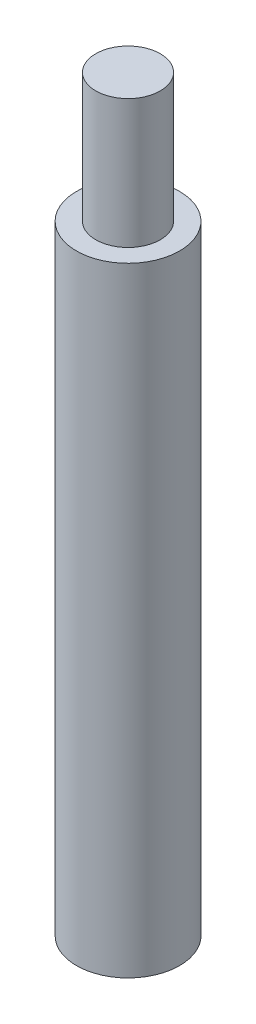
ISO-10303-21;
HEADER;
FILE_DESCRIPTION(('STEP AP214'),'2;1');
FILE_NAME('part.step','',(''),(''),'','','');
FILE_SCHEMA(('AUTOMOTIVE_DESIGN { 1 0 10303 214 1 1 1 1 }'));
ENDSEC;
DATA;
#1=APPLICATION_CONTEXT('core data for automotive mechanical design processes');
#2=APPLICATION_PROTOCOL_DEFINITION('international standard','automotive_design',2000,#1);
#3=PRODUCT_CONTEXT('',#1,'mechanical');
#4=PRODUCT('Part','Part','',(#3));
#5=PRODUCT_RELATED_PRODUCT_CATEGORY('part','',(#4));
#6=PRODUCT_DEFINITION_FORMATION('','',#4);
#7=PRODUCT_DEFINITION_CONTEXT('part definition',#1,'design');
#8=PRODUCT_DEFINITION('design','',#6,#7);
#9=PRODUCT_DEFINITION_SHAPE('','',#8);
#10=(LENGTH_UNIT() NAMED_UNIT(*) SI_UNIT(.MILLI.,.METRE.));
#11=(NAMED_UNIT(*) PLANE_ANGLE_UNIT() SI_UNIT($,.RADIAN.));
#12=(NAMED_UNIT(*) SI_UNIT($,.STERADIAN.) SOLID_ANGLE_UNIT());
#13=UNCERTAINTY_MEASURE_WITH_UNIT(LENGTH_MEASURE(1.E-05),#10,'distance_accuracy_value','');
#14=(GEOMETRIC_REPRESENTATION_CONTEXT(3) GLOBAL_UNCERTAINTY_ASSIGNED_CONTEXT((#13)) GLOBAL_UNIT_ASSIGNED_CONTEXT((#10,
#11,#12)) REPRESENTATION_CONTEXT('',''));
#15=CARTESIAN_POINT('',(0.,0.,0.));
#16=DIRECTION('',(0.,0.,1.));
#17=DIRECTION('',(1.,0.,0.));
#18=AXIS2_PLACEMENT_3D('',#15,#16,#17);
#19=CARTESIAN_POINT('',(-8.,0.,0.));
#20=DIRECTION('',(0.,1.,0.));
#21=DIRECTION('',(0.,0.,1.));
#22=AXIS2_PLACEMENT_3D('',#19,#20,#21);
#23=PLANE('',#22);
#24=CARTESIAN_POINT('',(0.,0.,0.));
#25=DIRECTION('',(0.,-1.,0.));
#26=DIRECTION('',(0.,0.,-1.));
#27=AXIS2_PLACEMENT_3D('',#24,#25,#26);
#28=CIRCLE('',#27,8.);
#29=CARTESIAN_POINT('',(0.,0.,-8.));
#30=VERTEX_POINT('',#29);
#31=EDGE_CURVE('E44',#30,#30,#28,.T.);
#32=ORIENTED_EDGE('',*,*,#31,.T.);
#33=EDGE_LOOP('',(#32));
#34=FACE_BOUND('',#33,.T.);
#35=ADVANCED_FACE('F30',(#34),#23,.F.);
#36=CARTESIAN_POINT('',(0.,116.,0.));
#37=DIRECTION('',(0.,-1.,0.));
#38=DIRECTION('',(0.,0.,-1.));
#39=AXIS2_PLACEMENT_3D('',#36,#37,#38);
#40=PLANE('',#39);
#41=CARTESIAN_POINT('',(0.,116.,0.));
#42=DIRECTION('',(0.,-1.,0.));
#43=DIRECTION('',(0.,0.,-1.));
#44=AXIS2_PLACEMENT_3D('',#41,#42,#43);
#45=CIRCLE('',#44,5.);
#46=CARTESIAN_POINT('',(0.,116.,-5.));
#47=VERTEX_POINT('',#46);
#48=EDGE_CURVE('E10',#47,#47,#45,.T.);
#49=ORIENTED_EDGE('',*,*,#48,.F.);
#50=EDGE_LOOP('',(#49));
#51=FACE_BOUND('',#50,.T.);
#52=ADVANCED_FACE('F64',(#51),#40,.F.);
#53=CARTESIAN_POINT('',(0.,0.,0.));
#54=DIRECTION('',(0.,-1.,0.));
#55=DIRECTION('',(0.,0.,-1.));
#56=AXIS2_PLACEMENT_3D('',#53,#54,#55);
#57=CYLINDRICAL_SURFACE('',#56,5.);
#58=CARTESIAN_POINT('',(0.,96.,0.));
#59=DIRECTION('',(0.,-1.,0.));
#60=DIRECTION('',(0.,0.,-1.));
#61=AXIS2_PLACEMENT_3D('',#58,#59,#60);
#62=CIRCLE('',#61,5.);
#63=CARTESIAN_POINT('',(0.,96.,-5.));
#64=VERTEX_POINT('',#63);
#65=EDGE_CURVE('E36',#64,#64,#62,.T.);
#66=ORIENTED_EDGE('',*,*,#65,.F.);
#67=EDGE_LOOP('',(#66));
#68=FACE_BOUND('',#67,.T.);
#69=ORIENTED_EDGE('',*,*,#48,.T.);
#70=EDGE_LOOP('',(#69));
#71=FACE_BOUND('',#70,.T.);
#72=ADVANCED_FACE('F59',(#68,#71),#57,.T.);
#73=CARTESIAN_POINT('',(-5.,96.,0.));
#74=DIRECTION('',(0.,-1.,0.));
#75=DIRECTION('',(0.,0.,-1.));
#76=AXIS2_PLACEMENT_3D('',#73,#74,#75);
#77=PLANE('',#76);
#78=CARTESIAN_POINT('',(0.,96.,0.));
#79=DIRECTION('',(0.,-1.,0.));
#80=DIRECTION('',(0.,0.,-1.));
#81=AXIS2_PLACEMENT_3D('',#78,#79,#80);
#82=CIRCLE('',#81,8.00000000000002);
#83=CARTESIAN_POINT('',(0.,96.,-8.00000000000002));
#84=VERTEX_POINT('',#83);
#85=EDGE_CURVE('E40',#84,#84,#82,.T.);
#86=ORIENTED_EDGE('',*,*,#85,.F.);
#87=EDGE_LOOP('',(#86));
#88=FACE_BOUND('',#87,.T.);
#89=ORIENTED_EDGE('',*,*,#65,.T.);
#90=EDGE_LOOP('',(#89));
#91=FACE_BOUND('',#90,.T.);
#92=ADVANCED_FACE('F54',(#88,#91),#77,.F.);
#93=CARTESIAN_POINT('',(0.,0.,0.));
#94=DIRECTION('',(0.,-1.,0.));
#95=DIRECTION('',(0.,0.,-1.));
#96=AXIS2_PLACEMENT_3D('',#93,#94,#95);
#97=CYLINDRICAL_SURFACE('',#96,8.00000000000001);
#98=ORIENTED_EDGE('',*,*,#31,.F.);
#99=EDGE_LOOP('',(#98));
#100=FACE_BOUND('',#99,.T.);
#101=ORIENTED_EDGE('',*,*,#85,.T.);
#102=EDGE_LOOP('',(#101));
#103=FACE_BOUND('',#102,.T.);
#104=ADVANCED_FACE('F51',(#100,#103),#97,.T.);
#105=CLOSED_SHELL('',(#35,#52,#72,#92,#104));
#106=MANIFOLD_SOLID_BREP('B2',#105);
#107=ADVANCED_BREP_SHAPE_REPRESENTATION('',(#18,#106),#14);
#108=SHAPE_DEFINITION_REPRESENTATION(#9,#107);
ENDSEC;
END-ISO-10303-21;
